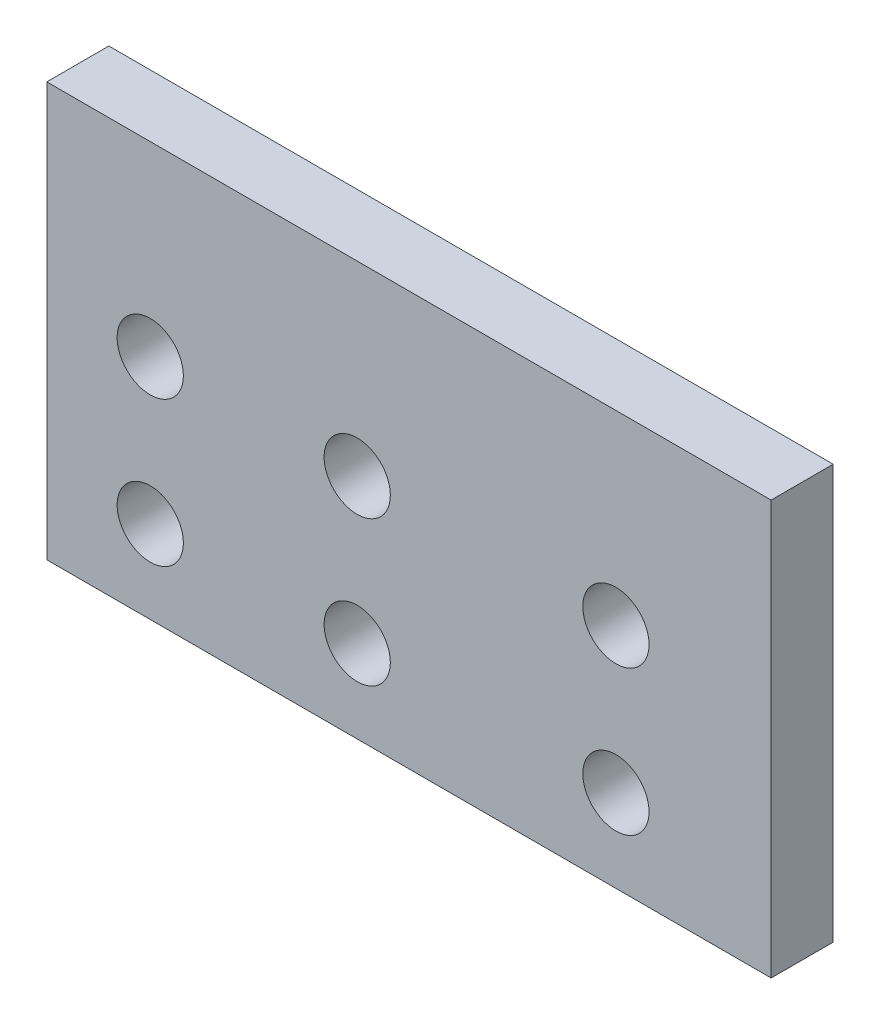
ISO-10303-21;
HEADER;
FILE_DESCRIPTION(('STEP AP214'),'2;1');
FILE_NAME('part.step','',(''),(''),'','','');
FILE_SCHEMA(('AUTOMOTIVE_DESIGN { 1 0 10303 214 1 1 1 1 }'));
ENDSEC;
DATA;
#1=APPLICATION_CONTEXT('core data for automotive mechanical design processes');
#2=APPLICATION_PROTOCOL_DEFINITION('international standard','automotive_design',2000,#1);
#3=PRODUCT_CONTEXT('',#1,'mechanical');
#4=PRODUCT('Part','Part','',(#3));
#5=PRODUCT_RELATED_PRODUCT_CATEGORY('part','',(#4));
#6=PRODUCT_DEFINITION_FORMATION('','',#4);
#7=PRODUCT_DEFINITION_CONTEXT('part definition',#1,'design');
#8=PRODUCT_DEFINITION('design','',#6,#7);
#9=PRODUCT_DEFINITION_SHAPE('','',#8);
#10=(LENGTH_UNIT() NAMED_UNIT(*) SI_UNIT(.MILLI.,.METRE.));
#11=(NAMED_UNIT(*) PLANE_ANGLE_UNIT() SI_UNIT($,.RADIAN.));
#12=(NAMED_UNIT(*) SI_UNIT($,.STERADIAN.) SOLID_ANGLE_UNIT());
#13=UNCERTAINTY_MEASURE_WITH_UNIT(LENGTH_MEASURE(1.E-05),#10,'distance_accuracy_value','');
#14=(GEOMETRIC_REPRESENTATION_CONTEXT(3) GLOBAL_UNCERTAINTY_ASSIGNED_CONTEXT((#13)) GLOBAL_UNIT_ASSIGNED_CONTEXT((#10,
#11,#12)) REPRESENTATION_CONTEXT('',''));
#15=CARTESIAN_POINT('',(0.,0.,0.));
#16=DIRECTION('',(0.,0.,1.));
#17=DIRECTION('',(1.,0.,0.));
#18=AXIS2_PLACEMENT_3D('',#15,#16,#17);
#19=CARTESIAN_POINT('',(0.,0.,3.));
#20=DIRECTION('',(0.,0.,1.));
#21=DIRECTION('',(1.,0.,0.));
#22=AXIS2_PLACEMENT_3D('',#19,#20,#21);
#23=PLANE('',#22);
#24=CARTESIAN_POINT('',(-2.5,0.999999999999999,3.));
#25=DIRECTION('',(0.,0.,1.));
#26=DIRECTION('',(1.,0.,0.));
#27=AXIS2_PLACEMENT_3D('',#24,#25,#26);
#28=CIRCLE('',#27,1.6);
#29=CARTESIAN_POINT('',(-0.9,0.999999999999999,3.));
#30=VERTEX_POINT('',#29);
#31=EDGE_CURVE('E139',#30,#30,#28,.T.);
#32=ORIENTED_EDGE('',*,*,#31,.F.);
#33=EDGE_LOOP('',(#32));
#34=FACE_BOUND('',#33,.T.);
#35=CARTESIAN_POINT('',(10.,0.999999999999999,3.));
#36=DIRECTION('',(0.,0.,1.));
#37=DIRECTION('',(1.,0.,0.));
#38=AXIS2_PLACEMENT_3D('',#35,#36,#37);
#39=CIRCLE('',#38,1.6);
#40=CARTESIAN_POINT('',(11.6,0.999999999999999,3.));
#41=VERTEX_POINT('',#40);
#42=EDGE_CURVE('E127',#41,#41,#39,.T.);
#43=ORIENTED_EDGE('',*,*,#42,.F.);
#44=EDGE_LOOP('',(#43));
#45=FACE_BOUND('',#44,.T.);
#46=CARTESIAN_POINT('',(-12.5,0.999999999999999,3.));
#47=DIRECTION('',(0.,0.,1.));
#48=DIRECTION('',(1.,0.,0.));
#49=AXIS2_PLACEMENT_3D('',#46,#47,#48);
#50=CIRCLE('',#49,1.6);
#51=CARTESIAN_POINT('',(-10.9,0.999999999999999,3.));
#52=VERTEX_POINT('',#51);
#53=EDGE_CURVE('E106',#52,#52,#50,.T.);
#54=ORIENTED_EDGE('',*,*,#53,.F.);
#55=EDGE_LOOP('',(#54));
#56=FACE_BOUND('',#55,.T.);
#57=DIRECTION('',(0.,-1.,0.));
#58=VECTOR('',#57,1.);
#59=CARTESIAN_POINT('',(-17.5,-10.,3.));
#60=LINE('',#59,#58);
#61=CARTESIAN_POINT('',(-17.5,10.,3.));
#62=VERTEX_POINT('',#61);
#63=CARTESIAN_POINT('',(-17.5,-10.,3.));
#64=VERTEX_POINT('',#63);
#65=EDGE_CURVE('E91',#62,#64,#60,.T.);
#66=ORIENTED_EDGE('',*,*,#65,.T.);
#67=DIRECTION('',(1.,0.,0.));
#68=VECTOR('',#67,1.);
#69=CARTESIAN_POINT('',(17.5,-10.,3.));
#70=LINE('',#69,#68);
#71=CARTESIAN_POINT('',(17.5,-10.,3.));
#72=VERTEX_POINT('',#71);
#73=EDGE_CURVE('E86',#64,#72,#70,.T.);
#74=ORIENTED_EDGE('',*,*,#73,.T.);
#75=DIRECTION('',(0.,1.,0.));
#76=VECTOR('',#75,1.);
#77=CARTESIAN_POINT('',(17.5,-10.,3.));
#78=LINE('',#77,#76);
#79=CARTESIAN_POINT('',(17.5,10.,3.));
#80=VERTEX_POINT('',#79);
#81=EDGE_CURVE('E89',#72,#80,#78,.T.);
#82=ORIENTED_EDGE('',*,*,#81,.T.);
#83=DIRECTION('',(-1.,0.,0.));
#84=VECTOR('',#83,1.);
#85=CARTESIAN_POINT('',(17.5,10.,3.));
#86=LINE('',#85,#84);
#87=EDGE_CURVE('E56',#80,#62,#86,.T.);
#88=ORIENTED_EDGE('',*,*,#87,.T.);
#89=EDGE_LOOP('',(#66,#74,#82,#88));
#90=FACE_BOUND('',#89,.T.);
#91=CARTESIAN_POINT('',(-12.5,-6.,3.));
#92=DIRECTION('',(0.,0.,1.));
#93=DIRECTION('',(1.,0.,0.));
#94=AXIS2_PLACEMENT_3D('',#91,#92,#93);
#95=CIRCLE('',#94,1.6);
#96=CARTESIAN_POINT('',(-10.9,-6.,3.));
#97=VERTEX_POINT('',#96);
#98=EDGE_CURVE('E121',#97,#97,#95,.T.);
#99=ORIENTED_EDGE('',*,*,#98,.F.);
#100=EDGE_LOOP('',(#99));
#101=FACE_BOUND('',#100,.T.);
#102=CARTESIAN_POINT('',(10.,-6.,3.));
#103=DIRECTION('',(0.,0.,1.));
#104=DIRECTION('',(1.,0.,0.));
#105=AXIS2_PLACEMENT_3D('',#102,#103,#104);
#106=CIRCLE('',#105,1.6);
#107=CARTESIAN_POINT('',(11.6,-6.,3.));
#108=VERTEX_POINT('',#107);
#109=EDGE_CURVE('E133',#108,#108,#106,.T.);
#110=ORIENTED_EDGE('',*,*,#109,.F.);
#111=EDGE_LOOP('',(#110));
#112=FACE_BOUND('',#111,.T.);
#113=CARTESIAN_POINT('',(-2.5,-6.,3.));
#114=DIRECTION('',(0.,0.,1.));
#115=DIRECTION('',(1.,0.,0.));
#116=AXIS2_PLACEMENT_3D('',#113,#114,#115);
#117=CIRCLE('',#116,1.6);
#118=CARTESIAN_POINT('',(-0.899999999999999,-6.,3.));
#119=VERTEX_POINT('',#118);
#120=EDGE_CURVE('E145',#119,#119,#117,.T.);
#121=ORIENTED_EDGE('',*,*,#120,.F.);
#122=EDGE_LOOP('',(#121));
#123=FACE_BOUND('',#122,.T.);
#124=ADVANCED_FACE('F39',(#34,#45,#56,#90,#101,#112,#123),#23,.T.);
#125=CARTESIAN_POINT('',(0.,0.,0.));
#126=DIRECTION('',(0.,0.,1.));
#127=DIRECTION('',(1.,0.,0.));
#128=AXIS2_PLACEMENT_3D('',#125,#126,#127);
#129=PLANE('',#128);
#130=DIRECTION('',(0.,-1.,0.));
#131=VECTOR('',#130,1.);
#132=CARTESIAN_POINT('',(-17.5,-10.,0.));
#133=LINE('',#132,#131);
#134=CARTESIAN_POINT('',(-17.5,10.,0.));
#135=VERTEX_POINT('',#134);
#136=CARTESIAN_POINT('',(-17.5,-10.,0.));
#137=VERTEX_POINT('',#136);
#138=EDGE_CURVE('E103',#135,#137,#133,.T.);
#139=ORIENTED_EDGE('',*,*,#138,.F.);
#140=DIRECTION('',(-1.,0.,0.));
#141=VECTOR('',#140,1.);
#142=CARTESIAN_POINT('',(17.5,10.,0.));
#143=LINE('',#142,#141);
#144=CARTESIAN_POINT('',(17.5,10.,0.));
#145=VERTEX_POINT('',#144);
#146=EDGE_CURVE('E79',#145,#135,#143,.T.);
#147=ORIENTED_EDGE('',*,*,#146,.F.);
#148=DIRECTION('',(0.,1.,0.));
#149=VECTOR('',#148,1.);
#150=CARTESIAN_POINT('',(17.5,-10.,0.));
#151=LINE('',#150,#149);
#152=CARTESIAN_POINT('',(17.5,-10.,0.));
#153=VERTEX_POINT('',#152);
#154=EDGE_CURVE('E73',#153,#145,#151,.T.);
#155=ORIENTED_EDGE('',*,*,#154,.F.);
#156=DIRECTION('',(1.,0.,0.));
#157=VECTOR('',#156,1.);
#158=CARTESIAN_POINT('',(17.5,-10.,0.));
#159=LINE('',#158,#157);
#160=EDGE_CURVE('E95',#137,#153,#159,.T.);
#161=ORIENTED_EDGE('',*,*,#160,.F.);
#162=EDGE_LOOP('',(#139,#147,#155,#161));
#163=FACE_BOUND('',#162,.T.);
#164=CARTESIAN_POINT('',(-12.5,0.999999999999999,0.));
#165=DIRECTION('',(0.,0.,1.));
#166=DIRECTION('',(1.,0.,0.));
#167=AXIS2_PLACEMENT_3D('',#164,#165,#166);
#168=CIRCLE('',#167,1.6);
#169=CARTESIAN_POINT('',(-10.9,0.999999999999999,0.));
#170=VERTEX_POINT('',#169);
#171=EDGE_CURVE('E118',#170,#170,#168,.T.);
#172=ORIENTED_EDGE('',*,*,#171,.T.);
#173=EDGE_LOOP('',(#172));
#174=FACE_BOUND('',#173,.T.);
#175=CARTESIAN_POINT('',(-12.5,-6.,0.));
#176=DIRECTION('',(0.,0.,1.));
#177=DIRECTION('',(1.,0.,0.));
#178=AXIS2_PLACEMENT_3D('',#175,#176,#177);
#179=CIRCLE('',#178,1.6);
#180=CARTESIAN_POINT('',(-10.9,-6.,0.));
#181=VERTEX_POINT('',#180);
#182=EDGE_CURVE('E124',#181,#181,#179,.T.);
#183=ORIENTED_EDGE('',*,*,#182,.T.);
#184=EDGE_LOOP('',(#183));
#185=FACE_BOUND('',#184,.T.);
#186=CARTESIAN_POINT('',(10.,0.999999999999999,0.));
#187=DIRECTION('',(0.,0.,1.));
#188=DIRECTION('',(1.,0.,0.));
#189=AXIS2_PLACEMENT_3D('',#186,#187,#188);
#190=CIRCLE('',#189,1.6);
#191=CARTESIAN_POINT('',(11.6,0.999999999999999,0.));
#192=VERTEX_POINT('',#191);
#193=EDGE_CURVE('E130',#192,#192,#190,.T.);
#194=ORIENTED_EDGE('',*,*,#193,.T.);
#195=EDGE_LOOP('',(#194));
#196=FACE_BOUND('',#195,.T.);
#197=CARTESIAN_POINT('',(10.,-6.,0.));
#198=DIRECTION('',(0.,0.,1.));
#199=DIRECTION('',(1.,0.,0.));
#200=AXIS2_PLACEMENT_3D('',#197,#198,#199);
#201=CIRCLE('',#200,1.6);
#202=CARTESIAN_POINT('',(11.6,-6.,0.));
#203=VERTEX_POINT('',#202);
#204=EDGE_CURVE('E136',#203,#203,#201,.T.);
#205=ORIENTED_EDGE('',*,*,#204,.T.);
#206=EDGE_LOOP('',(#205));
#207=FACE_BOUND('',#206,.T.);
#208=CARTESIAN_POINT('',(-2.5,0.999999999999999,0.));
#209=DIRECTION('',(0.,0.,1.));
#210=DIRECTION('',(1.,0.,0.));
#211=AXIS2_PLACEMENT_3D('',#208,#209,#210);
#212=CIRCLE('',#211,1.6);
#213=CARTESIAN_POINT('',(-0.9,0.999999999999999,0.));
#214=VERTEX_POINT('',#213);
#215=EDGE_CURVE('E142',#214,#214,#212,.T.);
#216=ORIENTED_EDGE('',*,*,#215,.T.);
#217=EDGE_LOOP('',(#216));
#218=FACE_BOUND('',#217,.T.);
#219=CARTESIAN_POINT('',(-2.5,-6.,0.));
#220=DIRECTION('',(0.,0.,1.));
#221=DIRECTION('',(1.,0.,0.));
#222=AXIS2_PLACEMENT_3D('',#219,#220,#221);
#223=CIRCLE('',#222,1.6);
#224=CARTESIAN_POINT('',(-0.899999999999999,-6.,0.));
#225=VERTEX_POINT('',#224);
#226=EDGE_CURVE('E148',#225,#225,#223,.T.);
#227=ORIENTED_EDGE('',*,*,#226,.T.);
#228=EDGE_LOOP('',(#227));
#229=FACE_BOUND('',#228,.T.);
#230=ADVANCED_FACE('F114',(#163,#174,#185,#196,#207,#218,#229),#129,.F.);
#231=CARTESIAN_POINT('',(-17.5,-10.,3.));
#232=DIRECTION('',(1.,0.,0.));
#233=DIRECTION('',(0.,0.,-1.));
#234=AXIS2_PLACEMENT_3D('',#231,#232,#233);
#235=PLANE('',#234);
#236=ORIENTED_EDGE('',*,*,#138,.T.);
#237=DIRECTION('',(0.,0.,-1.));
#238=VECTOR('',#237,1.);
#239=CARTESIAN_POINT('',(-17.5,-10.,3.));
#240=LINE('',#239,#238);
#241=EDGE_CURVE('E11',#64,#137,#240,.T.);
#242=ORIENTED_EDGE('',*,*,#241,.F.);
#243=ORIENTED_EDGE('',*,*,#65,.F.);
#244=DIRECTION('',(0.,0.,-1.));
#245=VECTOR('',#244,1.);
#246=CARTESIAN_POINT('',(-17.5,10.,3.));
#247=LINE('',#246,#245);
#248=EDGE_CURVE('E99',#62,#135,#247,.T.);
#249=ORIENTED_EDGE('',*,*,#248,.T.);
#250=EDGE_LOOP('',(#236,#242,#243,#249));
#251=FACE_BOUND('',#250,.T.);
#252=ADVANCED_FACE('F41',(#251),#235,.F.);
#253=CARTESIAN_POINT('',(17.5,-10.,3.));
#254=DIRECTION('',(0.,1.,0.));
#255=DIRECTION('',(0.,0.,1.));
#256=AXIS2_PLACEMENT_3D('',#253,#254,#255);
#257=PLANE('',#256);
#258=ORIENTED_EDGE('',*,*,#160,.T.);
#259=DIRECTION('',(0.,0.,-1.));
#260=VECTOR('',#259,1.);
#261=CARTESIAN_POINT('',(17.5,-10.,3.));
#262=LINE('',#261,#260);
#263=EDGE_CURVE('E48',#72,#153,#262,.T.);
#264=ORIENTED_EDGE('',*,*,#263,.F.);
#265=ORIENTED_EDGE('',*,*,#73,.F.);
#266=ORIENTED_EDGE('',*,*,#241,.T.);
#267=EDGE_LOOP('',(#258,#264,#265,#266));
#268=FACE_BOUND('',#267,.T.);
#269=ADVANCED_FACE('F94',(#268),#257,.F.);
#270=CARTESIAN_POINT('',(17.5,-10.,3.));
#271=DIRECTION('',(-1.,0.,0.));
#272=DIRECTION('',(0.,0.,1.));
#273=AXIS2_PLACEMENT_3D('',#270,#271,#272);
#274=PLANE('',#273);
#275=ORIENTED_EDGE('',*,*,#154,.T.);
#276=DIRECTION('',(0.,0.,-1.));
#277=VECTOR('',#276,1.);
#278=CARTESIAN_POINT('',(17.5,10.,3.));
#279=LINE('',#278,#277);
#280=EDGE_CURVE('E96',#80,#145,#279,.T.);
#281=ORIENTED_EDGE('',*,*,#280,.F.);
#282=ORIENTED_EDGE('',*,*,#81,.F.);
#283=ORIENTED_EDGE('',*,*,#263,.T.);
#284=EDGE_LOOP('',(#275,#281,#282,#283));
#285=FACE_BOUND('',#284,.T.);
#286=ADVANCED_FACE('F97',(#285),#274,.F.);
#287=CARTESIAN_POINT('',(17.5,10.,3.));
#288=DIRECTION('',(0.,-1.,0.));
#289=DIRECTION('',(0.,0.,-1.));
#290=AXIS2_PLACEMENT_3D('',#287,#288,#289);
#291=PLANE('',#290);
#292=ORIENTED_EDGE('',*,*,#146,.T.);
#293=ORIENTED_EDGE('',*,*,#248,.F.);
#294=ORIENTED_EDGE('',*,*,#87,.F.);
#295=ORIENTED_EDGE('',*,*,#280,.T.);
#296=EDGE_LOOP('',(#292,#293,#294,#295));
#297=FACE_BOUND('',#296,.T.);
#298=ADVANCED_FACE('F111',(#297),#291,.F.);
#299=CARTESIAN_POINT('',(-12.5,0.999999999999999,3.));
#300=DIRECTION('',(0.,0.,-1.));
#301=DIRECTION('',(-1.,0.,0.));
#302=AXIS2_PLACEMENT_3D('',#299,#300,#301);
#303=CYLINDRICAL_SURFACE('',#302,1.6);
#304=ORIENTED_EDGE('',*,*,#53,.T.);
#305=EDGE_LOOP('',(#304));
#306=FACE_BOUND('',#305,.T.);
#307=ORIENTED_EDGE('',*,*,#171,.F.);
#308=EDGE_LOOP('',(#307));
#309=FACE_BOUND('',#308,.T.);
#310=ADVANCED_FACE('F167',(#306,#309),#303,.F.);
#311=CARTESIAN_POINT('',(-12.5,-6.,3.));
#312=DIRECTION('',(0.,0.,-1.));
#313=DIRECTION('',(-1.,0.,0.));
#314=AXIS2_PLACEMENT_3D('',#311,#312,#313);
#315=CYLINDRICAL_SURFACE('',#314,1.6);
#316=ORIENTED_EDGE('',*,*,#98,.T.);
#317=EDGE_LOOP('',(#316));
#318=FACE_BOUND('',#317,.T.);
#319=ORIENTED_EDGE('',*,*,#182,.F.);
#320=EDGE_LOOP('',(#319));
#321=FACE_BOUND('',#320,.T.);
#322=ADVANCED_FACE('F221',(#318,#321),#315,.F.);
#323=CARTESIAN_POINT('',(10.,0.999999999999999,3.));
#324=DIRECTION('',(0.,0.,-1.));
#325=DIRECTION('',(-1.,0.,0.));
#326=AXIS2_PLACEMENT_3D('',#323,#324,#325);
#327=CYLINDRICAL_SURFACE('',#326,1.6);
#328=ORIENTED_EDGE('',*,*,#42,.T.);
#329=EDGE_LOOP('',(#328));
#330=FACE_BOUND('',#329,.T.);
#331=ORIENTED_EDGE('',*,*,#193,.F.);
#332=EDGE_LOOP('',(#331));
#333=FACE_BOUND('',#332,.T.);
#334=ADVANCED_FACE('F230',(#330,#333),#327,.F.);
#335=CARTESIAN_POINT('',(10.,-6.,3.));
#336=DIRECTION('',(0.,0.,-1.));
#337=DIRECTION('',(-1.,0.,0.));
#338=AXIS2_PLACEMENT_3D('',#335,#336,#337);
#339=CYLINDRICAL_SURFACE('',#338,1.6);
#340=ORIENTED_EDGE('',*,*,#109,.T.);
#341=EDGE_LOOP('',(#340));
#342=FACE_BOUND('',#341,.T.);
#343=ORIENTED_EDGE('',*,*,#204,.F.);
#344=EDGE_LOOP('',(#343));
#345=FACE_BOUND('',#344,.T.);
#346=ADVANCED_FACE('F239',(#342,#345),#339,.F.);
#347=CARTESIAN_POINT('',(-2.5,0.999999999999999,3.));
#348=DIRECTION('',(0.,0.,-1.));
#349=DIRECTION('',(-1.,0.,0.));
#350=AXIS2_PLACEMENT_3D('',#347,#348,#349);
#351=CYLINDRICAL_SURFACE('',#350,1.6);
#352=ORIENTED_EDGE('',*,*,#31,.T.);
#353=EDGE_LOOP('',(#352));
#354=FACE_BOUND('',#353,.T.);
#355=ORIENTED_EDGE('',*,*,#215,.F.);
#356=EDGE_LOOP('',(#355));
#357=FACE_BOUND('',#356,.T.);
#358=ADVANCED_FACE('F249',(#354,#357),#351,.F.);
#359=CARTESIAN_POINT('',(-2.5,-6.,3.));
#360=DIRECTION('',(0.,0.,-1.));
#361=DIRECTION('',(-1.,0.,0.));
#362=AXIS2_PLACEMENT_3D('',#359,#360,#361);
#363=CYLINDRICAL_SURFACE('',#362,1.6);
#364=ORIENTED_EDGE('',*,*,#120,.T.);
#365=EDGE_LOOP('',(#364));
#366=FACE_BOUND('',#365,.T.);
#367=ORIENTED_EDGE('',*,*,#226,.F.);
#368=EDGE_LOOP('',(#367));
#369=FACE_BOUND('',#368,.T.);
#370=ADVANCED_FACE('F154',(#366,#369),#363,.F.);
#371=CLOSED_SHELL('',(#124,#230,#252,#269,#286,#298,#310,#322,#334,#346,#358,#370));
#372=MANIFOLD_SOLID_BREP('B2',#371);
#373=ADVANCED_BREP_SHAPE_REPRESENTATION('',(#18,#372),#14);
#374=SHAPE_DEFINITION_REPRESENTATION(#9,#373);
ENDSEC;
END-ISO-10303-21;
